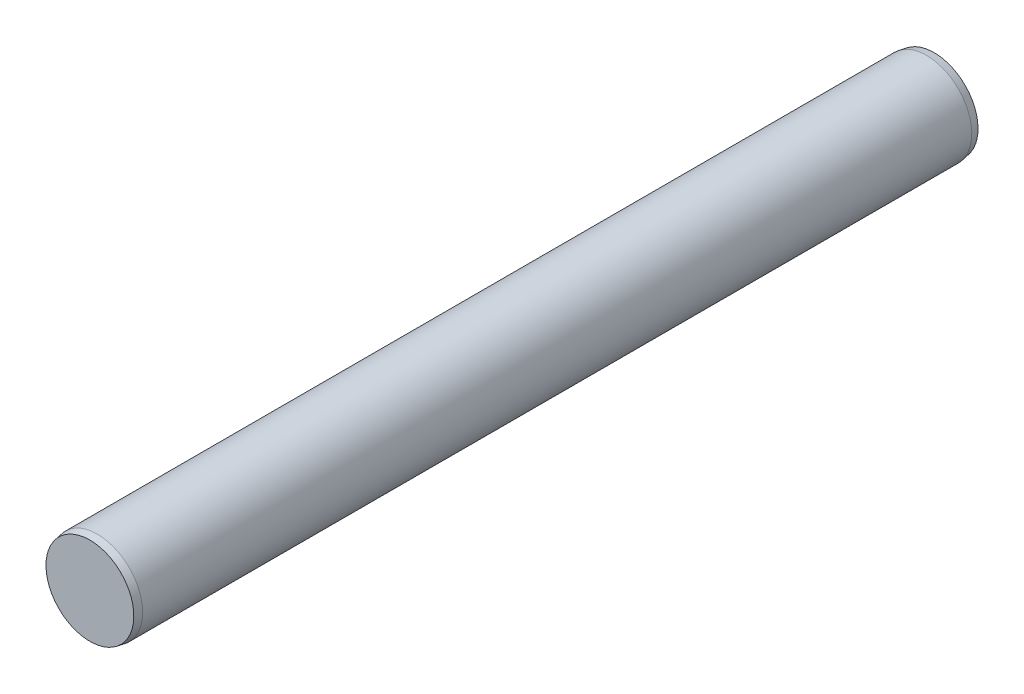
ISO-10303-21;
HEADER;
FILE_DESCRIPTION(('STEP AP214'),'2;1');
FILE_NAME('part.step','',(''),(''),'','','');
FILE_SCHEMA(('AUTOMOTIVE_DESIGN { 1 0 10303 214 1 1 1 1 }'));
ENDSEC;
DATA;
#1=APPLICATION_CONTEXT('core data for automotive mechanical design processes');
#2=APPLICATION_PROTOCOL_DEFINITION('international standard','automotive_design',2000,#1);
#3=PRODUCT_CONTEXT('',#1,'mechanical');
#4=PRODUCT('Part','Part','',(#3));
#5=PRODUCT_RELATED_PRODUCT_CATEGORY('part','',(#4));
#6=PRODUCT_DEFINITION_FORMATION('','',#4);
#7=PRODUCT_DEFINITION_CONTEXT('part definition',#1,'design');
#8=PRODUCT_DEFINITION('design','',#6,#7);
#9=PRODUCT_DEFINITION_SHAPE('','',#8);
#10=(LENGTH_UNIT() NAMED_UNIT(*) SI_UNIT(.MILLI.,.METRE.));
#11=(NAMED_UNIT(*) PLANE_ANGLE_UNIT() SI_UNIT($,.RADIAN.));
#12=(NAMED_UNIT(*) SI_UNIT($,.STERADIAN.) SOLID_ANGLE_UNIT());
#13=UNCERTAINTY_MEASURE_WITH_UNIT(LENGTH_MEASURE(1.E-05),#10,'distance_accuracy_value','');
#14=(GEOMETRIC_REPRESENTATION_CONTEXT(3) GLOBAL_UNCERTAINTY_ASSIGNED_CONTEXT((#13)) GLOBAL_UNIT_ASSIGNED_CONTEXT((#10,
#11,#12)) REPRESENTATION_CONTEXT('',''));
#15=CARTESIAN_POINT('',(0.,0.,0.));
#16=DIRECTION('',(0.,0.,1.));
#17=DIRECTION('',(1.,0.,0.));
#18=AXIS2_PLACEMENT_3D('',#15,#16,#17);
#19=CARTESIAN_POINT('',(0.,3.175,355.6));
#20=DIRECTION('',(0.,0.,-1.));
#21=DIRECTION('',(0.,1.,0.));
#22=AXIS2_PLACEMENT_3D('',#19,#20,#21);
#23=PLANE('',#22);
#24=CARTESIAN_POINT('',(0.,0.,355.6));
#25=DIRECTION('',(0.,0.,-1.));
#26=DIRECTION('',(0.,1.,0.));
#27=AXIS2_PLACEMENT_3D('',#24,#25,#26);
#28=CIRCLE('',#27,18.4912);
#29=CARTESIAN_POINT('',(0.,18.4912,355.6));
#30=VERTEX_POINT('',#29);
#31=EDGE_CURVE('E10',#30,#30,#28,.F.);
#32=ORIENTED_EDGE('',*,*,#31,.T.);
#33=EDGE_LOOP('',(#32));
#34=FACE_BOUND('',#33,.T.);
#35=ADVANCED_FACE('F30',(#34),#23,.F.);
#36=CARTESIAN_POINT('',(0.,0.,50.6569139540752));
#37=DIRECTION('',(0.,0.,1.));
#38=DIRECTION('',(0.,-1.,0.));
#39=AXIS2_PLACEMENT_3D('',#36,#37,#38);
#40=CYLINDRICAL_SURFACE('',#39,19.05);
#41=CARTESIAN_POINT('',(0.,0.,3.175));
#42=DIRECTION('',(0.,0.,1.));
#43=DIRECTION('',(0.,-1.,0.));
#44=AXIS2_PLACEMENT_3D('',#41,#42,#43);
#45=CIRCLE('',#44,19.05);
#46=CARTESIAN_POINT('',(0.,-19.05,3.175));
#47=VERTEX_POINT('',#46);
#48=EDGE_CURVE('E40',#47,#47,#45,.T.);
#49=ORIENTED_EDGE('',*,*,#48,.T.);
#50=EDGE_LOOP('',(#49));
#51=FACE_BOUND('',#50,.T.);
#52=CARTESIAN_POINT('',(0.,0.,352.425));
#53=DIRECTION('',(0.,0.,-1.));
#54=DIRECTION('',(0.,1.,0.));
#55=AXIS2_PLACEMENT_3D('',#52,#53,#54);
#56=CIRCLE('',#55,19.05);
#57=CARTESIAN_POINT('',(0.,19.05,352.425));
#58=VERTEX_POINT('',#57);
#59=EDGE_CURVE('E44',#58,#58,#56,.T.);
#60=ORIENTED_EDGE('',*,*,#59,.T.);
#61=EDGE_LOOP('',(#60));
#62=FACE_BOUND('',#61,.T.);
#63=ADVANCED_FACE('F50',(#51,#62),#40,.T.);
#64=CARTESIAN_POINT('',(0.,19.05,0.));
#65=DIRECTION('',(0.,0.,1.));
#66=DIRECTION('',(0.,-1.,0.));
#67=AXIS2_PLACEMENT_3D('',#64,#65,#66);
#68=PLANE('',#67);
#69=CARTESIAN_POINT('',(0.,0.,0.));
#70=DIRECTION('',(0.,0.,1.));
#71=DIRECTION('',(0.,-1.,0.));
#72=AXIS2_PLACEMENT_3D('',#69,#70,#71);
#73=CIRCLE('',#72,18.4912);
#74=CARTESIAN_POINT('',(0.,-18.4912,0.));
#75=VERTEX_POINT('',#74);
#76=EDGE_CURVE('E36',#75,#75,#73,.F.);
#77=ORIENTED_EDGE('',*,*,#76,.T.);
#78=EDGE_LOOP('',(#77));
#79=FACE_BOUND('',#78,.T.);
#80=ADVANCED_FACE('F60',(#79),#68,.F.);
#81=CARTESIAN_POINT('',(0.,0.,3.175));
#82=DIRECTION('',(0.,0.,1.));
#83=DIRECTION('',(0.,-1.,0.));
#84=AXIS2_PLACEMENT_3D('',#81,#82,#83);
#85=CONICAL_SURFACE('',#84,19.05,0.174215786442943);
#86=ORIENTED_EDGE('',*,*,#76,.F.);
#87=EDGE_LOOP('',(#86));
#88=FACE_BOUND('',#87,.T.);
#89=ORIENTED_EDGE('',*,*,#48,.F.);
#90=EDGE_LOOP('',(#89));
#91=FACE_BOUND('',#90,.T.);
#92=ADVANCED_FACE('F55',(#88,#91),#85,.T.);
#93=CARTESIAN_POINT('',(0.,0.,355.6));
#94=DIRECTION('',(0.,0.,-1.));
#95=DIRECTION('',(0.,1.,0.));
#96=AXIS2_PLACEMENT_3D('',#93,#94,#95);
#97=CONICAL_SURFACE('',#96,18.4912,0.174215786442942);
#98=ORIENTED_EDGE('',*,*,#59,.F.);
#99=EDGE_LOOP('',(#98));
#100=FACE_BOUND('',#99,.T.);
#101=ORIENTED_EDGE('',*,*,#31,.F.);
#102=EDGE_LOOP('',(#101));
#103=FACE_BOUND('',#102,.T.);
#104=ADVANCED_FACE('F52',(#100,#103),#97,.T.);
#105=CLOSED_SHELL('',(#35,#63,#80,#92,#104));
#106=MANIFOLD_SOLID_BREP('B2',#105);
#107=ADVANCED_BREP_SHAPE_REPRESENTATION('',(#18,#106),#14);
#108=SHAPE_DEFINITION_REPRESENTATION(#9,#107);
ENDSEC;
END-ISO-10303-21;
